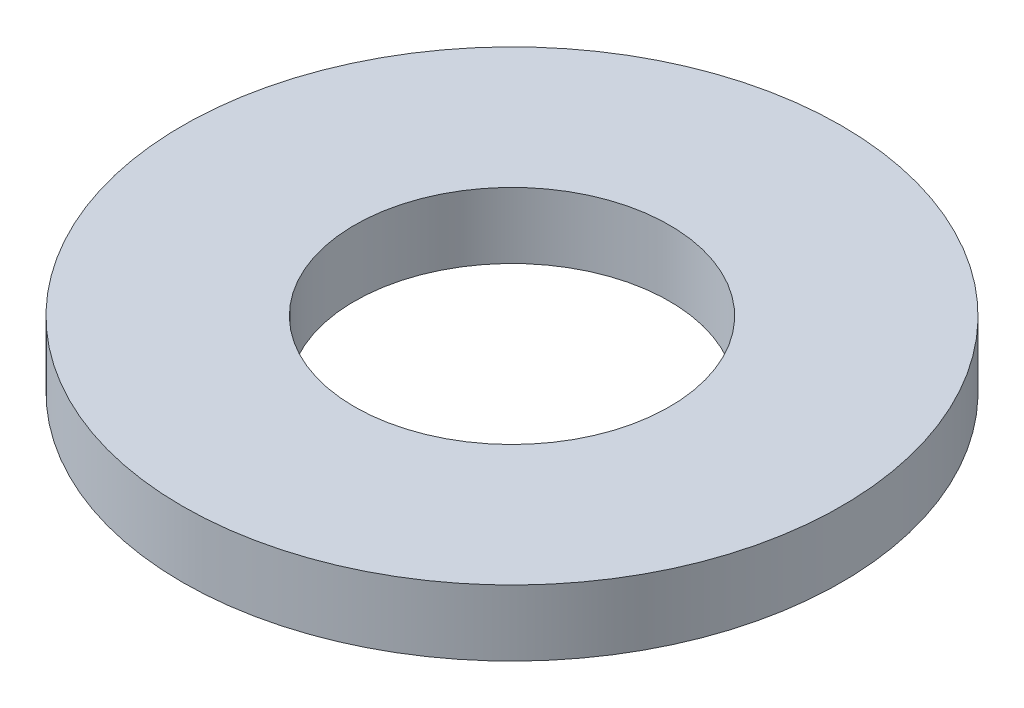
ISO-10303-21;
HEADER;
FILE_DESCRIPTION(('STEP AP214'),'2;1');
FILE_NAME('part.step','',(''),(''),'','','');
FILE_SCHEMA(('AUTOMOTIVE_DESIGN { 1 0 10303 214 1 1 1 1 }'));
ENDSEC;
DATA;
#1=APPLICATION_CONTEXT('core data for automotive mechanical design processes');
#2=APPLICATION_PROTOCOL_DEFINITION('international standard','automotive_design',2000,#1);
#3=PRODUCT_CONTEXT('',#1,'mechanical');
#4=PRODUCT('Part','Part','',(#3));
#5=PRODUCT_RELATED_PRODUCT_CATEGORY('part','',(#4));
#6=PRODUCT_DEFINITION_FORMATION('','',#4);
#7=PRODUCT_DEFINITION_CONTEXT('part definition',#1,'design');
#8=PRODUCT_DEFINITION('design','',#6,#7);
#9=PRODUCT_DEFINITION_SHAPE('','',#8);
#10=(LENGTH_UNIT() NAMED_UNIT(*) SI_UNIT(.MILLI.,.METRE.));
#11=(NAMED_UNIT(*) PLANE_ANGLE_UNIT() SI_UNIT($,.RADIAN.));
#12=(NAMED_UNIT(*) SI_UNIT($,.STERADIAN.) SOLID_ANGLE_UNIT());
#13=UNCERTAINTY_MEASURE_WITH_UNIT(LENGTH_MEASURE(1.E-05),#10,'distance_accuracy_value','');
#14=(GEOMETRIC_REPRESENTATION_CONTEXT(3) GLOBAL_UNCERTAINTY_ASSIGNED_CONTEXT((#13)) GLOBAL_UNIT_ASSIGNED_CONTEXT((#10,
#11,#12)) REPRESENTATION_CONTEXT('',''));
#15=CARTESIAN_POINT('',(0.,0.,0.));
#16=DIRECTION('',(0.,0.,1.));
#17=DIRECTION('',(1.,0.,0.));
#18=AXIS2_PLACEMENT_3D('',#15,#16,#17);
#19=CARTESIAN_POINT('',(0.,0.9,0.));
#20=DIRECTION('',(0.,1.,0.));
#21=DIRECTION('',(0.,0.,1.));
#22=AXIS2_PLACEMENT_3D('',#19,#20,#21);
#23=PLANE('',#22);
#24=CARTESIAN_POINT('',(0.,0.9,0.));
#25=DIRECTION('',(0.,1.,0.));
#26=DIRECTION('',(0.,0.,1.));
#27=AXIS2_PLACEMENT_3D('',#24,#25,#26);
#28=CIRCLE('',#27,4.5);
#29=CARTESIAN_POINT('',(0.,0.9,4.5));
#30=VERTEX_POINT('',#29);
#31=EDGE_CURVE('E10',#30,#30,#28,.T.);
#32=ORIENTED_EDGE('',*,*,#31,.T.);
#33=EDGE_LOOP('',(#32));
#34=FACE_BOUND('',#33,.T.);
#35=CARTESIAN_POINT('',(0.,0.9,0.));
#36=DIRECTION('',(0.,1.,0.));
#37=DIRECTION('',(0.,0.,1.));
#38=AXIS2_PLACEMENT_3D('',#35,#36,#37);
#39=CIRCLE('',#38,2.15);
#40=CARTESIAN_POINT('',(0.,0.9,2.15));
#41=VERTEX_POINT('',#40);
#42=EDGE_CURVE('E42',#41,#41,#39,.T.);
#43=ORIENTED_EDGE('',*,*,#42,.F.);
#44=EDGE_LOOP('',(#43));
#45=FACE_BOUND('',#44,.T.);
#46=ADVANCED_FACE('F31',(#34,#45),#23,.T.);
#47=CARTESIAN_POINT('',(0.,0.,0.));
#48=DIRECTION('',(0.,1.,0.));
#49=DIRECTION('',(0.,0.,1.));
#50=AXIS2_PLACEMENT_3D('',#47,#48,#49);
#51=PLANE('',#50);
#52=CARTESIAN_POINT('',(0.,0.,0.));
#53=DIRECTION('',(0.,1.,0.));
#54=DIRECTION('',(0.,0.,1.));
#55=AXIS2_PLACEMENT_3D('',#52,#53,#54);
#56=CIRCLE('',#55,4.5);
#57=CARTESIAN_POINT('',(0.,0.,4.5));
#58=VERTEX_POINT('',#57);
#59=EDGE_CURVE('E35',#58,#58,#56,.T.);
#60=ORIENTED_EDGE('',*,*,#59,.F.);
#61=EDGE_LOOP('',(#60));
#62=FACE_BOUND('',#61,.T.);
#63=CARTESIAN_POINT('',(0.,0.,0.));
#64=DIRECTION('',(0.,1.,0.));
#65=DIRECTION('',(0.,0.,1.));
#66=AXIS2_PLACEMENT_3D('',#63,#64,#65);
#67=CIRCLE('',#66,2.15);
#68=CARTESIAN_POINT('',(0.,0.,2.15));
#69=VERTEX_POINT('',#68);
#70=EDGE_CURVE('E44',#69,#69,#67,.T.);
#71=ORIENTED_EDGE('',*,*,#70,.T.);
#72=EDGE_LOOP('',(#71));
#73=FACE_BOUND('',#72,.T.);
#74=ADVANCED_FACE('F54',(#62,#73),#51,.F.);
#75=CARTESIAN_POINT('',(0.,0.9,0.));
#76=DIRECTION('',(0.,-1.,0.));
#77=DIRECTION('',(0.,0.,-1.));
#78=AXIS2_PLACEMENT_3D('',#75,#76,#77);
#79=CYLINDRICAL_SURFACE('',#78,4.5);
#80=ORIENTED_EDGE('',*,*,#31,.F.);
#81=EDGE_LOOP('',(#80));
#82=FACE_BOUND('',#81,.T.);
#83=ORIENTED_EDGE('',*,*,#59,.T.);
#84=EDGE_LOOP('',(#83));
#85=FACE_BOUND('',#84,.T.);
#86=ADVANCED_FACE('F33',(#82,#85),#79,.T.);
#87=CARTESIAN_POINT('',(0.,0.9,0.));
#88=DIRECTION('',(0.,-1.,0.));
#89=DIRECTION('',(0.,0.,-1.));
#90=AXIS2_PLACEMENT_3D('',#87,#88,#89);
#91=CYLINDRICAL_SURFACE('',#90,2.15);
#92=ORIENTED_EDGE('',*,*,#42,.T.);
#93=EDGE_LOOP('',(#92));
#94=FACE_BOUND('',#93,.T.);
#95=ORIENTED_EDGE('',*,*,#70,.F.);
#96=EDGE_LOOP('',(#95));
#97=FACE_BOUND('',#96,.T.);
#98=ADVANCED_FACE('F50',(#94,#97),#91,.F.);
#99=CLOSED_SHELL('',(#46,#74,#86,#98));
#100=MANIFOLD_SOLID_BREP('B2',#99);
#101=ADVANCED_BREP_SHAPE_REPRESENTATION('',(#18,#100),#14);
#102=SHAPE_DEFINITION_REPRESENTATION(#9,#101);
ENDSEC;
END-ISO-10303-21;
